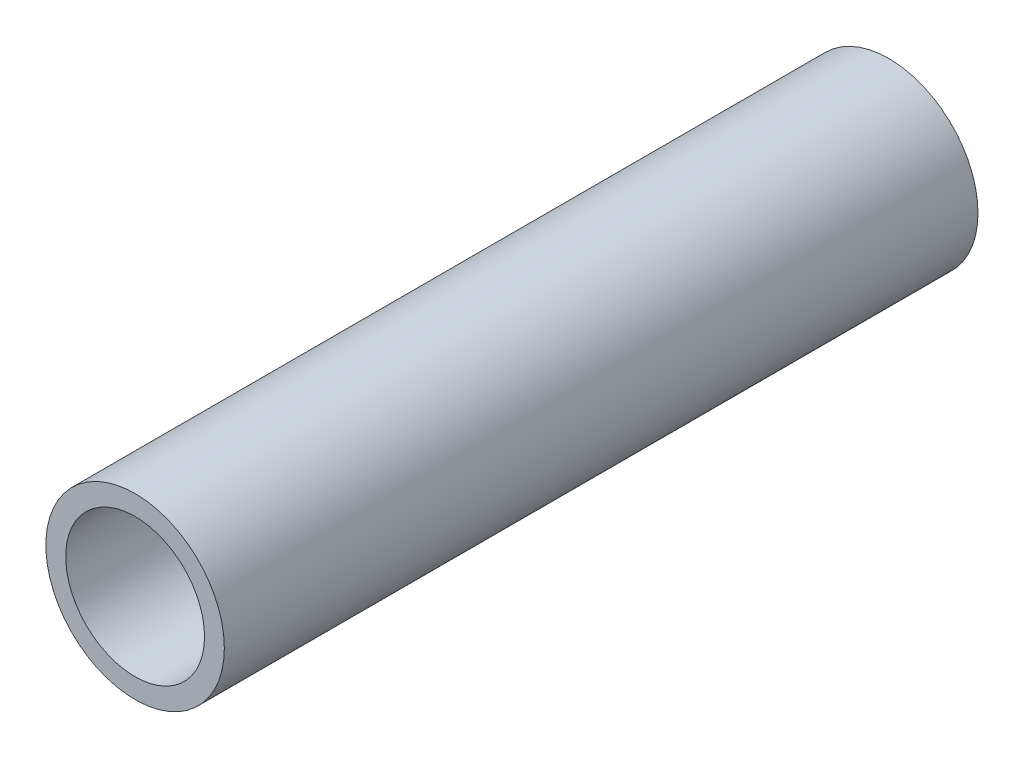
ISO-10303-21;
HEADER;
FILE_DESCRIPTION(('STEP AP214'),'2;1');
FILE_NAME('part.step','',(''),(''),'','','');
FILE_SCHEMA(('AUTOMOTIVE_DESIGN { 1 0 10303 214 1 1 1 1 }'));
ENDSEC;
DATA;
#1=APPLICATION_CONTEXT('core data for automotive mechanical design processes');
#2=APPLICATION_PROTOCOL_DEFINITION('international standard','automotive_design',2000,#1);
#3=PRODUCT_CONTEXT('',#1,'mechanical');
#4=PRODUCT('Part','Part','',(#3));
#5=PRODUCT_RELATED_PRODUCT_CATEGORY('part','',(#4));
#6=PRODUCT_DEFINITION_FORMATION('','',#4);
#7=PRODUCT_DEFINITION_CONTEXT('part definition',#1,'design');
#8=PRODUCT_DEFINITION('design','',#6,#7);
#9=PRODUCT_DEFINITION_SHAPE('','',#8);
#10=(LENGTH_UNIT() NAMED_UNIT(*) SI_UNIT(.MILLI.,.METRE.));
#11=(NAMED_UNIT(*) PLANE_ANGLE_UNIT() SI_UNIT($,.RADIAN.));
#12=(NAMED_UNIT(*) SI_UNIT($,.STERADIAN.) SOLID_ANGLE_UNIT());
#13=UNCERTAINTY_MEASURE_WITH_UNIT(LENGTH_MEASURE(1.E-05),#10,'distance_accuracy_value','');
#14=(GEOMETRIC_REPRESENTATION_CONTEXT(3) GLOBAL_UNCERTAINTY_ASSIGNED_CONTEXT((#13)) GLOBAL_UNIT_ASSIGNED_CONTEXT((#10,
#11,#12)) REPRESENTATION_CONTEXT('',''));
#15=CARTESIAN_POINT('',(0.,0.,0.));
#16=DIRECTION('',(0.,0.,1.));
#17=DIRECTION('',(1.,0.,0.));
#18=AXIS2_PLACEMENT_3D('',#15,#16,#17);
#19=CARTESIAN_POINT('',(0.,0.,76.));
#20=DIRECTION('',(0.,0.,1.));
#21=DIRECTION('',(1.,0.,0.));
#22=AXIS2_PLACEMENT_3D('',#19,#20,#21);
#23=PLANE('',#22);
#24=CARTESIAN_POINT('',(0.,0.,76.));
#25=DIRECTION('',(0.,0.,1.));
#26=DIRECTION('',(1.,0.,0.));
#27=AXIS2_PLACEMENT_3D('',#24,#25,#26);
#28=CIRCLE('',#27,9.);
#29=CARTESIAN_POINT('',(9.,0.,76.));
#30=VERTEX_POINT('',#29);
#31=EDGE_CURVE('E10',#30,#30,#28,.T.);
#32=ORIENTED_EDGE('',*,*,#31,.T.);
#33=EDGE_LOOP('',(#32));
#34=FACE_BOUND('',#33,.T.);
#35=CARTESIAN_POINT('',(0.,0.,76.));
#36=DIRECTION('',(0.,0.,1.));
#37=DIRECTION('',(1.,0.,0.));
#38=AXIS2_PLACEMENT_3D('',#35,#36,#37);
#39=CIRCLE('',#38,7.);
#40=CARTESIAN_POINT('',(7.,0.,76.));
#41=VERTEX_POINT('',#40);
#42=EDGE_CURVE('E53',#41,#41,#39,.T.);
#43=ORIENTED_EDGE('',*,*,#42,.F.);
#44=EDGE_LOOP('',(#43));
#45=FACE_BOUND('',#44,.T.);
#46=ADVANCED_FACE('F39',(#34,#45),#23,.T.);
#47=CARTESIAN_POINT('',(0.,0.,0.));
#48=DIRECTION('',(0.,0.,1.));
#49=DIRECTION('',(1.,0.,0.));
#50=AXIS2_PLACEMENT_3D('',#47,#48,#49);
#51=PLANE('',#50);
#52=CARTESIAN_POINT('',(0.,0.,0.));
#53=DIRECTION('',(0.,0.,1.));
#54=DIRECTION('',(1.,0.,0.));
#55=AXIS2_PLACEMENT_3D('',#52,#53,#54);
#56=CIRCLE('',#55,9.);
#57=CARTESIAN_POINT('',(9.,0.,0.));
#58=VERTEX_POINT('',#57);
#59=EDGE_CURVE('E47',#58,#58,#56,.T.);
#60=ORIENTED_EDGE('',*,*,#59,.F.);
#61=EDGE_LOOP('',(#60));
#62=FACE_BOUND('',#61,.T.);
#63=CARTESIAN_POINT('',(0.,0.,0.));
#64=DIRECTION('',(0.,0.,1.));
#65=DIRECTION('',(1.,0.,0.));
#66=AXIS2_PLACEMENT_3D('',#63,#64,#65);
#67=CIRCLE('',#66,7.);
#68=CARTESIAN_POINT('',(7.,0.,0.));
#69=VERTEX_POINT('',#68);
#70=EDGE_CURVE('E59',#69,#69,#67,.T.);
#71=ORIENTED_EDGE('',*,*,#70,.T.);
#72=EDGE_LOOP('',(#71));
#73=FACE_BOUND('',#72,.T.);
#74=ADVANCED_FACE('F67',(#62,#73),#51,.F.);
#75=CARTESIAN_POINT('',(0.,0.,76.));
#76=DIRECTION('',(0.,0.,-1.));
#77=DIRECTION('',(-1.,0.,0.));
#78=AXIS2_PLACEMENT_3D('',#75,#76,#77);
#79=CYLINDRICAL_SURFACE('',#78,9.);
#80=ORIENTED_EDGE('',*,*,#31,.F.);
#81=EDGE_LOOP('',(#80));
#82=FACE_BOUND('',#81,.T.);
#83=ORIENTED_EDGE('',*,*,#59,.T.);
#84=EDGE_LOOP('',(#83));
#85=FACE_BOUND('',#84,.T.);
#86=ADVANCED_FACE('F41',(#82,#85),#79,.T.);
#87=CARTESIAN_POINT('',(0.,0.,76.));
#88=DIRECTION('',(0.,0.,-1.));
#89=DIRECTION('',(-1.,0.,0.));
#90=AXIS2_PLACEMENT_3D('',#87,#88,#89);
#91=CYLINDRICAL_SURFACE('',#90,7.);
#92=ORIENTED_EDGE('',*,*,#42,.T.);
#93=EDGE_LOOP('',(#92));
#94=FACE_BOUND('',#93,.T.);
#95=ORIENTED_EDGE('',*,*,#70,.F.);
#96=EDGE_LOOP('',(#95));
#97=FACE_BOUND('',#96,.T.);
#98=ADVANCED_FACE('F69',(#94,#97),#91,.F.);
#99=CLOSED_SHELL('',(#46,#74,#86,#98));
#100=MANIFOLD_SOLID_BREP('B2',#99);
#101=ADVANCED_BREP_SHAPE_REPRESENTATION('',(#18,#100),#14);
#102=SHAPE_DEFINITION_REPRESENTATION(#9,#101);
ENDSEC;
END-ISO-10303-21;
